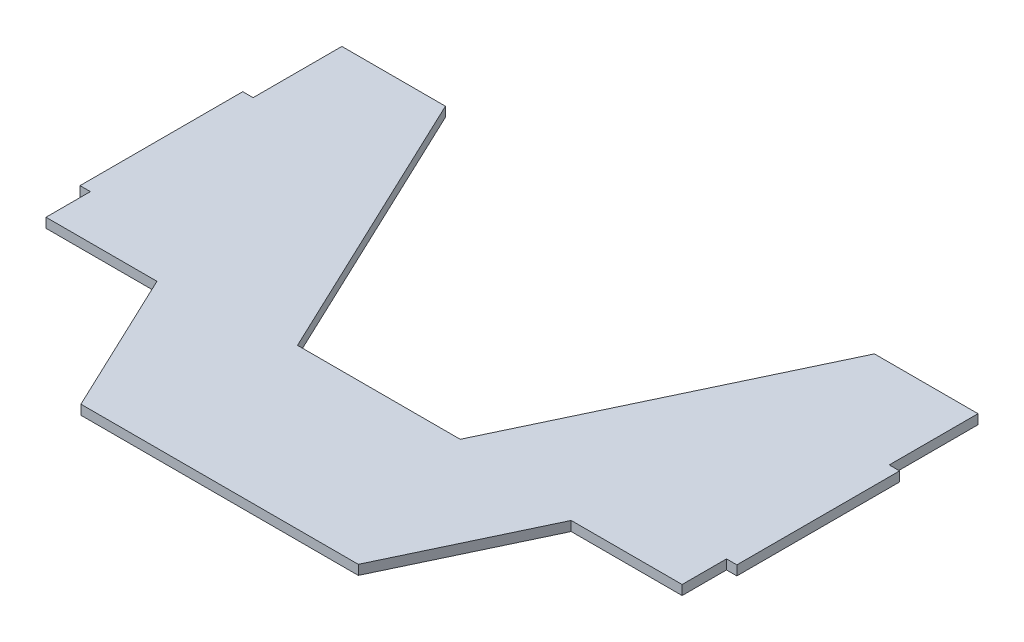
ISO-10303-21;
HEADER;
FILE_DESCRIPTION(('STEP AP214'),'2;1');
FILE_NAME('part.step','',(''),(''),'','','');
FILE_SCHEMA(('AUTOMOTIVE_DESIGN { 1 0 10303 214 1 1 1 1 }'));
ENDSEC;
DATA;
#1=APPLICATION_CONTEXT('core data for automotive mechanical design processes');
#2=APPLICATION_PROTOCOL_DEFINITION('international standard','automotive_design',2000,#1);
#3=PRODUCT_CONTEXT('',#1,'mechanical');
#4=PRODUCT('Part','Part','',(#3));
#5=PRODUCT_RELATED_PRODUCT_CATEGORY('part','',(#4));
#6=PRODUCT_DEFINITION_FORMATION('','',#4);
#7=PRODUCT_DEFINITION_CONTEXT('part definition',#1,'design');
#8=PRODUCT_DEFINITION('design','',#6,#7);
#9=PRODUCT_DEFINITION_SHAPE('','',#8);
#10=(LENGTH_UNIT() NAMED_UNIT(*) SI_UNIT(.MILLI.,.METRE.));
#11=(NAMED_UNIT(*) PLANE_ANGLE_UNIT() SI_UNIT($,.RADIAN.));
#12=(NAMED_UNIT(*) SI_UNIT($,.STERADIAN.) SOLID_ANGLE_UNIT());
#13=UNCERTAINTY_MEASURE_WITH_UNIT(LENGTH_MEASURE(1.E-05),#10,'distance_accuracy_value','');
#14=(GEOMETRIC_REPRESENTATION_CONTEXT(3) GLOBAL_UNCERTAINTY_ASSIGNED_CONTEXT((#13)) GLOBAL_UNIT_ASSIGNED_CONTEXT((#10,
#11,#12)) REPRESENTATION_CONTEXT('',''));
#15=CARTESIAN_POINT('',(0.,0.,0.));
#16=DIRECTION('',(0.,0.,1.));
#17=DIRECTION('',(1.,0.,0.));
#18=AXIS2_PLACEMENT_3D('',#15,#16,#17);
#19=CARTESIAN_POINT('',(-43.,1.3,20.));
#20=DIRECTION('',(0.,0.,-1.));
#21=DIRECTION('',(-1.,0.,0.));
#22=AXIS2_PLACEMENT_3D('',#19,#20,#21);
#23=PLANE('',#22);
#24=DIRECTION('',(0.,-1.,0.));
#25=VECTOR('',#24,1.);
#26=CARTESIAN_POINT('',(-28.,1.3,20.));
#27=LINE('',#26,#25);
#28=CARTESIAN_POINT('',(-28.,1.3,20.));
#29=VERTEX_POINT('',#28);
#30=CARTESIAN_POINT('',(-28.,0.,20.));
#31=VERTEX_POINT('',#30);
#32=EDGE_CURVE('E187',#29,#31,#27,.T.);
#33=ORIENTED_EDGE('',*,*,#32,.F.);
#34=DIRECTION('',(1.,0.,0.));
#35=VECTOR('',#34,1.);
#36=CARTESIAN_POINT('',(-43.,1.3,20.));
#37=LINE('',#36,#35);
#38=CARTESIAN_POINT('',(-43.,1.3,20.));
#39=VERTEX_POINT('',#38);
#40=EDGE_CURVE('E200',#39,#29,#37,.T.);
#41=ORIENTED_EDGE('',*,*,#40,.F.);
#42=DIRECTION('',(0.,-1.,0.));
#43=VECTOR('',#42,1.);
#44=CARTESIAN_POINT('',(-43.,1.3,20.));
#45=LINE('',#44,#43);
#46=CARTESIAN_POINT('',(-43.,0.,20.));
#47=VERTEX_POINT('',#46);
#48=EDGE_CURVE('E219',#39,#47,#45,.T.);
#49=ORIENTED_EDGE('',*,*,#48,.T.);
#50=DIRECTION('',(1.,0.,0.));
#51=VECTOR('',#50,1.);
#52=CARTESIAN_POINT('',(-43.,0.,20.));
#53=LINE('',#52,#51);
#54=EDGE_CURVE('E202',#47,#31,#53,.T.);
#55=ORIENTED_EDGE('',*,*,#54,.T.);
#56=EDGE_LOOP('',(#33,#41,#49,#55));
#57=FACE_BOUND('',#56,.T.);
#58=ADVANCED_FACE('F43',(#57),#23,.F.);
#59=CARTESIAN_POINT('',(-43.,1.3,-20.));
#60=DIRECTION('',(0.,0.,1.));
#61=DIRECTION('',(1.,0.,0.));
#62=AXIS2_PLACEMENT_3D('',#59,#60,#61);
#63=PLANE('',#62);
#64=DIRECTION('',(-1.,0.,0.));
#65=VECTOR('',#64,1.);
#66=CARTESIAN_POINT('',(-43.,1.3,-20.));
#67=LINE('',#66,#65);
#68=CARTESIAN_POINT('',(-29.,1.3,-20.));
#69=VERTEX_POINT('',#68);
#70=CARTESIAN_POINT('',(-43.,1.3,-20.));
#71=VERTEX_POINT('',#70);
#72=EDGE_CURVE('E306',#69,#71,#67,.T.);
#73=ORIENTED_EDGE('',*,*,#72,.F.);
#74=DIRECTION('',(0.,1.,0.));
#75=VECTOR('',#74,1.);
#76=CARTESIAN_POINT('',(-29.,0.,-20.));
#77=LINE('',#76,#75);
#78=CARTESIAN_POINT('',(-29.,0.,-20.));
#79=VERTEX_POINT('',#78);
#80=EDGE_CURVE('E319',#79,#69,#77,.T.);
#81=ORIENTED_EDGE('',*,*,#80,.F.);
#82=DIRECTION('',(-1.,0.,0.));
#83=VECTOR('',#82,1.);
#84=CARTESIAN_POINT('',(-43.,0.,-20.));
#85=LINE('',#84,#83);
#86=CARTESIAN_POINT('',(-43.,0.,-20.));
#87=VERTEX_POINT('',#86);
#88=EDGE_CURVE('E229',#79,#87,#85,.T.);
#89=ORIENTED_EDGE('',*,*,#88,.T.);
#90=DIRECTION('',(0.,-1.,0.));
#91=VECTOR('',#90,1.);
#92=CARTESIAN_POINT('',(-43.,1.3,-20.));
#93=LINE('',#92,#91);
#94=EDGE_CURVE('E52',#71,#87,#93,.T.);
#95=ORIENTED_EDGE('',*,*,#94,.F.);
#96=EDGE_LOOP('',(#73,#81,#89,#95));
#97=FACE_BOUND('',#96,.T.);
#98=ADVANCED_FACE('F318',(#97),#63,.F.);
#99=CARTESIAN_POINT('',(43.,1.3,-20.));
#100=DIRECTION('',(-1.,0.,0.));
#101=DIRECTION('',(0.,0.,1.));
#102=AXIS2_PLACEMENT_3D('',#99,#100,#101);
#103=PLANE('',#102);
#104=DIRECTION('',(0.,1.,0.));
#105=VECTOR('',#104,1.);
#106=CARTESIAN_POINT('',(43.,0.,-8.));
#107=LINE('',#106,#105);
#108=CARTESIAN_POINT('',(43.,0.,-8.));
#109=VERTEX_POINT('',#108);
#110=CARTESIAN_POINT('',(43.,1.3,-8.));
#111=VERTEX_POINT('',#110);
#112=EDGE_CURVE('E326',#109,#111,#107,.T.);
#113=ORIENTED_EDGE('',*,*,#112,.F.);
#114=DIRECTION('',(0.,0.,-1.));
#115=VECTOR('',#114,1.);
#116=CARTESIAN_POINT('',(43.,0.,-20.));
#117=LINE('',#116,#115);
#118=CARTESIAN_POINT('',(43.,0.,-20.));
#119=VERTEX_POINT('',#118);
#120=EDGE_CURVE('E230',#109,#119,#117,.T.);
#121=ORIENTED_EDGE('',*,*,#120,.T.);
#122=DIRECTION('',(0.,-1.,0.));
#123=VECTOR('',#122,1.);
#124=CARTESIAN_POINT('',(43.,1.3,-20.));
#125=LINE('',#124,#123);
#126=CARTESIAN_POINT('',(43.,1.3,-20.));
#127=VERTEX_POINT('',#126);
#128=EDGE_CURVE('E11',#127,#119,#125,.T.);
#129=ORIENTED_EDGE('',*,*,#128,.F.);
#130=DIRECTION('',(0.,0.,-1.));
#131=VECTOR('',#130,1.);
#132=CARTESIAN_POINT('',(43.,1.3,-20.));
#133=LINE('',#132,#131);
#134=EDGE_CURVE('E242',#111,#127,#133,.T.);
#135=ORIENTED_EDGE('',*,*,#134,.F.);
#136=EDGE_LOOP('',(#113,#121,#129,#135));
#137=FACE_BOUND('',#136,.T.);
#138=ADVANCED_FACE('F391',(#137),#103,.F.);
#139=CARTESIAN_POINT('',(-43.,1.3,-20.));
#140=DIRECTION('',(1.,0.,0.));
#141=DIRECTION('',(0.,0.,-1.));
#142=AXIS2_PLACEMENT_3D('',#139,#140,#141);
#143=PLANE('',#142);
#144=DIRECTION('',(0.,1.,0.));
#145=VECTOR('',#144,1.);
#146=CARTESIAN_POINT('',(-43.,0.,14.));
#147=LINE('',#146,#145);
#148=CARTESIAN_POINT('',(-43.,0.,14.));
#149=VERTEX_POINT('',#148);
#150=CARTESIAN_POINT('',(-43.,1.3,14.));
#151=VERTEX_POINT('',#150);
#152=EDGE_CURVE('E292',#149,#151,#147,.T.);
#153=ORIENTED_EDGE('',*,*,#152,.F.);
#154=DIRECTION('',(0.,0.,1.));
#155=VECTOR('',#154,1.);
#156=CARTESIAN_POINT('',(-43.,0.,-20.));
#157=LINE('',#156,#155);
#158=EDGE_CURVE('E235',#149,#47,#157,.T.);
#159=ORIENTED_EDGE('',*,*,#158,.T.);
#160=ORIENTED_EDGE('',*,*,#48,.F.);
#161=DIRECTION('',(0.,0.,1.));
#162=VECTOR('',#161,1.);
#163=CARTESIAN_POINT('',(-43.,1.3,-20.));
#164=LINE('',#163,#162);
#165=EDGE_CURVE('E210',#151,#39,#164,.T.);
#166=ORIENTED_EDGE('',*,*,#165,.F.);
#167=EDGE_LOOP('',(#153,#159,#160,#166));
#168=FACE_BOUND('',#167,.T.);
#169=ADVANCED_FACE('F404',(#168),#143,.F.);
#170=CARTESIAN_POINT('',(43.,0.,20.));
#171=VERTEX_POINT('',#170);
#172=CARTESIAN_POINT('',(43.,0.,14.));
#173=VERTEX_POINT('',#172);
#174=EDGE_CURVE('E225',#171,#173,#117,.T.);
#175=ORIENTED_EDGE('',*,*,#174,.T.);
#176=DIRECTION('',(0.,1.,0.));
#177=VECTOR('',#176,1.);
#178=CARTESIAN_POINT('',(43.,0.,14.));
#179=LINE('',#178,#177);
#180=CARTESIAN_POINT('',(43.,1.3,14.));
#181=VERTEX_POINT('',#180);
#182=EDGE_CURVE('E335',#173,#181,#179,.T.);
#183=ORIENTED_EDGE('',*,*,#182,.T.);
#184=CARTESIAN_POINT('',(43.,1.3,20.));
#185=VERTEX_POINT('',#184);
#186=EDGE_CURVE('E303',#185,#181,#133,.T.);
#187=ORIENTED_EDGE('',*,*,#186,.F.);
#188=DIRECTION('',(0.,-1.,0.));
#189=VECTOR('',#188,1.);
#190=CARTESIAN_POINT('',(43.,1.3,20.));
#191=LINE('',#190,#189);
#192=EDGE_CURVE('E213',#185,#171,#191,.T.);
#193=ORIENTED_EDGE('',*,*,#192,.T.);
#194=EDGE_LOOP('',(#175,#183,#187,#193));
#195=FACE_BOUND('',#194,.T.);
#196=ADVANCED_FACE('F45',(#195),#103,.F.);
#197=CARTESIAN_POINT('',(29.,0.,-20.));
#198=VERTEX_POINT('',#197);
#199=EDGE_CURVE('E231',#119,#198,#85,.T.);
#200=ORIENTED_EDGE('',*,*,#199,.T.);
#201=DIRECTION('',(0.,1.,0.));
#202=VECTOR('',#201,1.);
#203=CARTESIAN_POINT('',(29.,0.,-20.));
#204=LINE('',#203,#202);
#205=CARTESIAN_POINT('',(29.,1.3,-20.));
#206=VERTEX_POINT('',#205);
#207=EDGE_CURVE('E67',#198,#206,#204,.T.);
#208=ORIENTED_EDGE('',*,*,#207,.T.);
#209=EDGE_CURVE('E307',#127,#206,#67,.T.);
#210=ORIENTED_EDGE('',*,*,#209,.F.);
#211=ORIENTED_EDGE('',*,*,#128,.T.);
#212=EDGE_LOOP('',(#200,#208,#210,#211));
#213=FACE_BOUND('',#212,.T.);
#214=ADVANCED_FACE('F396',(#213),#63,.F.);
#215=CARTESIAN_POINT('',(-43.,0.,-8.));
#216=VERTEX_POINT('',#215);
#217=EDGE_CURVE('E236',#87,#216,#157,.T.);
#218=ORIENTED_EDGE('',*,*,#217,.T.);
#219=DIRECTION('',(0.,1.,0.));
#220=VECTOR('',#219,1.);
#221=CARTESIAN_POINT('',(-43.,0.,-8.));
#222=LINE('',#221,#220);
#223=CARTESIAN_POINT('',(-43.,1.3,-8.));
#224=VERTEX_POINT('',#223);
#225=EDGE_CURVE('E283',#216,#224,#222,.T.);
#226=ORIENTED_EDGE('',*,*,#225,.T.);
#227=EDGE_CURVE('E221',#71,#224,#164,.T.);
#228=ORIENTED_EDGE('',*,*,#227,.F.);
#229=ORIENTED_EDGE('',*,*,#94,.T.);
#230=EDGE_LOOP('',(#218,#226,#228,#229));
#231=FACE_BOUND('',#230,.T.);
#232=ADVANCED_FACE('F251',(#231),#143,.F.);
#233=CARTESIAN_POINT('',(28.,1.3,20.));
#234=VERTEX_POINT('',#233);
#235=EDGE_CURVE('E214',#234,#185,#37,.T.);
#236=ORIENTED_EDGE('',*,*,#235,.F.);
#237=DIRECTION('',(0.,-1.,0.));
#238=VECTOR('',#237,1.);
#239=CARTESIAN_POINT('',(28.,1.3,20.));
#240=LINE('',#239,#238);
#241=CARTESIAN_POINT('',(28.,0.,20.));
#242=VERTEX_POINT('',#241);
#243=EDGE_CURVE('E380',#234,#242,#240,.T.);
#244=ORIENTED_EDGE('',*,*,#243,.T.);
#245=EDGE_CURVE('E240',#242,#171,#53,.T.);
#246=ORIENTED_EDGE('',*,*,#245,.T.);
#247=ORIENTED_EDGE('',*,*,#192,.F.);
#248=EDGE_LOOP('',(#236,#244,#246,#247));
#249=FACE_BOUND('',#248,.T.);
#250=ADVANCED_FACE('F379',(#249),#23,.F.);
#251=CARTESIAN_POINT('',(0.,1.3,0.));
#252=DIRECTION('',(0.,1.,0.));
#253=DIRECTION('',(0.,0.,1.));
#254=AXIS2_PLACEMENT_3D('',#251,#252,#253);
#255=PLANE('',#254);
#256=DIRECTION('',(0.428086344739045,0.,0.903737838893539));
#257=VECTOR('',#256,1.);
#258=CARTESIAN_POINT('',(-15.947963800905,1.3,7.55429864253394));
#259=LINE('',#258,#257);
#260=CARTESIAN_POINT('',(-11.,1.3,18.));
#261=VERTEX_POINT('',#260);
#262=EDGE_CURVE('E316',#69,#261,#259,.T.);
#263=ORIENTED_EDGE('',*,*,#262,.F.);
#264=ORIENTED_EDGE('',*,*,#72,.T.);
#265=ORIENTED_EDGE('',*,*,#227,.T.);
#266=DIRECTION('',(-1.,0.,0.));
#267=VECTOR('',#266,1.);
#268=CARTESIAN_POINT('',(-43.,1.3,-8.));
#269=LINE('',#268,#267);
#270=CARTESIAN_POINT('',(-44.4,1.3,-8.));
#271=VERTEX_POINT('',#270);
#272=EDGE_CURVE('E284',#224,#271,#269,.T.);
#273=ORIENTED_EDGE('',*,*,#272,.T.);
#274=DIRECTION('',(0.,0.,1.));
#275=VECTOR('',#274,1.);
#276=CARTESIAN_POINT('',(-44.4,1.3,-8.));
#277=LINE('',#276,#275);
#278=CARTESIAN_POINT('',(-44.4,1.3,14.));
#279=VERTEX_POINT('',#278);
#280=EDGE_CURVE('E275',#271,#279,#277,.T.);
#281=ORIENTED_EDGE('',*,*,#280,.T.);
#282=DIRECTION('',(1.,0.,0.));
#283=VECTOR('',#282,1.);
#284=CARTESIAN_POINT('',(-43.,1.3,14.));
#285=LINE('',#284,#283);
#286=EDGE_CURVE('E269',#279,#151,#285,.T.);
#287=ORIENTED_EDGE('',*,*,#286,.T.);
#288=ORIENTED_EDGE('',*,*,#165,.T.);
#289=ORIENTED_EDGE('',*,*,#40,.T.);
#290=DIRECTION('',(0.428086344739045,0.,0.903737838893539));
#291=VECTOR('',#290,1.);
#292=CARTESIAN_POINT('',(-28.,1.3,20.));
#293=LINE('',#292,#291);
#294=CARTESIAN_POINT('',(-18.75,1.3,39.5277777777778));
#295=VERTEX_POINT('',#294);
#296=EDGE_CURVE('E184',#29,#295,#293,.T.);
#297=ORIENTED_EDGE('',*,*,#296,.T.);
#298=DIRECTION('',(1.,0.,0.));
#299=VECTOR('',#298,1.);
#300=CARTESIAN_POINT('',(-18.75,1.3,39.5277777777778));
#301=LINE('',#300,#299);
#302=CARTESIAN_POINT('',(18.75,1.3,39.5277777777778));
#303=VERTEX_POINT('',#302);
#304=EDGE_CURVE('E195',#295,#303,#301,.T.);
#305=ORIENTED_EDGE('',*,*,#304,.T.);
#306=DIRECTION('',(0.428086344739045,0.,-0.903737838893539));
#307=VECTOR('',#306,1.);
#308=CARTESIAN_POINT('',(18.75,1.3,39.5277777777778));
#309=LINE('',#308,#307);
#310=EDGE_CURVE('E645',#303,#234,#309,.T.);
#311=ORIENTED_EDGE('',*,*,#310,.T.);
#312=ORIENTED_EDGE('',*,*,#235,.T.);
#313=ORIENTED_EDGE('',*,*,#186,.T.);
#314=DIRECTION('',(1.,0.,0.));
#315=VECTOR('',#314,1.);
#316=CARTESIAN_POINT('',(43.,1.3,14.));
#317=LINE('',#316,#315);
#318=CARTESIAN_POINT('',(44.4,1.3,14.));
#319=VERTEX_POINT('',#318);
#320=EDGE_CURVE('E288',#181,#319,#317,.T.);
#321=ORIENTED_EDGE('',*,*,#320,.T.);
#322=DIRECTION('',(0.,0.,-1.));
#323=VECTOR('',#322,1.);
#324=CARTESIAN_POINT('',(44.4,1.3,-8.));
#325=LINE('',#324,#323);
#326=CARTESIAN_POINT('',(44.4,1.3,-8.));
#327=VERTEX_POINT('',#326);
#328=EDGE_CURVE('E352',#319,#327,#325,.T.);
#329=ORIENTED_EDGE('',*,*,#328,.T.);
#330=DIRECTION('',(-1.,0.,0.));
#331=VECTOR('',#330,1.);
#332=CARTESIAN_POINT('',(43.,1.3,-8.));
#333=LINE('',#332,#331);
#334=EDGE_CURVE('E348',#327,#111,#333,.T.);
#335=ORIENTED_EDGE('',*,*,#334,.T.);
#336=ORIENTED_EDGE('',*,*,#134,.T.);
#337=ORIENTED_EDGE('',*,*,#209,.T.);
#338=DIRECTION('',(0.428086344739045,0.,-0.903737838893539));
#339=VECTOR('',#338,1.);
#340=CARTESIAN_POINT('',(15.947963800905,1.3,7.55429864253393));
#341=LINE('',#340,#339);
#342=CARTESIAN_POINT('',(11.,1.3,18.));
#343=VERTEX_POINT('',#342);
#344=EDGE_CURVE('E667',#343,#206,#341,.T.);
#345=ORIENTED_EDGE('',*,*,#344,.F.);
#346=DIRECTION('',(1.,0.,0.));
#347=VECTOR('',#346,1.);
#348=CARTESIAN_POINT('',(0.,1.3,18.));
#349=LINE('',#348,#347);
#350=EDGE_CURVE('E204',#261,#343,#349,.T.);
#351=ORIENTED_EDGE('',*,*,#350,.F.);
#352=EDGE_LOOP('',(#263,#264,#265,#273,#281,#287,#288,#289,#297,#305,#311,#312,#313,#321,#329,
#335,#336,#337,#345,#351));
#353=FACE_BOUND('',#352,.T.);
#354=ADVANCED_FACE('F207',(#353),#255,.T.);
#355=CARTESIAN_POINT('',(0.,0.,0.));
#356=DIRECTION('',(0.,1.,0.));
#357=DIRECTION('',(0.,0.,1.));
#358=AXIS2_PLACEMENT_3D('',#355,#356,#357);
#359=PLANE('',#358);
#360=ORIENTED_EDGE('',*,*,#88,.F.);
#361=DIRECTION('',(0.428086344739045,0.,0.903737838893539));
#362=VECTOR('',#361,1.);
#363=CARTESIAN_POINT('',(-15.947963800905,0.,7.55429864253394));
#364=LINE('',#363,#362);
#365=CARTESIAN_POINT('',(-11.,0.,18.));
#366=VERTEX_POINT('',#365);
#367=EDGE_CURVE('E334',#79,#366,#364,.T.);
#368=ORIENTED_EDGE('',*,*,#367,.T.);
#369=DIRECTION('',(1.,0.,0.));
#370=VECTOR('',#369,1.);
#371=CARTESIAN_POINT('',(0.,0.,18.));
#372=LINE('',#371,#370);
#373=CARTESIAN_POINT('',(11.,0.,18.));
#374=VERTEX_POINT('',#373);
#375=EDGE_CURVE('E657',#366,#374,#372,.T.);
#376=ORIENTED_EDGE('',*,*,#375,.T.);
#377=DIRECTION('',(0.428086344739045,0.,-0.903737838893539));
#378=VECTOR('',#377,1.);
#379=CARTESIAN_POINT('',(15.947963800905,0.,7.55429864253393));
#380=LINE('',#379,#378);
#381=EDGE_CURVE('E394',#374,#198,#380,.T.);
#382=ORIENTED_EDGE('',*,*,#381,.T.);
#383=ORIENTED_EDGE('',*,*,#199,.F.);
#384=ORIENTED_EDGE('',*,*,#120,.F.);
#385=DIRECTION('',(-1.,0.,0.));
#386=VECTOR('',#385,1.);
#387=CARTESIAN_POINT('',(43.,0.,-8.));
#388=LINE('',#387,#386);
#389=CARTESIAN_POINT('',(44.4,0.,-8.));
#390=VERTEX_POINT('',#389);
#391=EDGE_CURVE('E339',#390,#109,#388,.T.);
#392=ORIENTED_EDGE('',*,*,#391,.F.);
#393=DIRECTION('',(0.,0.,-1.));
#394=VECTOR('',#393,1.);
#395=CARTESIAN_POINT('',(44.4,0.,-8.));
#396=LINE('',#395,#394);
#397=CARTESIAN_POINT('',(44.4,0.,14.));
#398=VERTEX_POINT('',#397);
#399=EDGE_CURVE('E360',#398,#390,#396,.T.);
#400=ORIENTED_EDGE('',*,*,#399,.F.);
#401=DIRECTION('',(1.,0.,0.));
#402=VECTOR('',#401,1.);
#403=CARTESIAN_POINT('',(43.,0.,14.));
#404=LINE('',#403,#402);
#405=EDGE_CURVE('E278',#173,#398,#404,.T.);
#406=ORIENTED_EDGE('',*,*,#405,.F.);
#407=ORIENTED_EDGE('',*,*,#174,.F.);
#408=ORIENTED_EDGE('',*,*,#245,.F.);
#409=DIRECTION('',(0.428086344739045,0.,-0.903737838893539));
#410=VECTOR('',#409,1.);
#411=CARTESIAN_POINT('',(18.75,0.,39.5277777777778));
#412=LINE('',#411,#410);
#413=CARTESIAN_POINT('',(18.75,0.,39.5277777777778));
#414=VERTEX_POINT('',#413);
#415=EDGE_CURVE('E59',#414,#242,#412,.T.);
#416=ORIENTED_EDGE('',*,*,#415,.F.);
#417=DIRECTION('',(1.,0.,0.));
#418=VECTOR('',#417,1.);
#419=CARTESIAN_POINT('',(-18.75,0.,39.5277777777778));
#420=LINE('',#419,#418);
#421=CARTESIAN_POINT('',(-18.75,0.,39.5277777777778));
#422=VERTEX_POINT('',#421);
#423=EDGE_CURVE('E639',#422,#414,#420,.T.);
#424=ORIENTED_EDGE('',*,*,#423,.F.);
#425=DIRECTION('',(0.428086344739045,0.,0.903737838893539));
#426=VECTOR('',#425,1.);
#427=CARTESIAN_POINT('',(-28.,0.,20.));
#428=LINE('',#427,#426);
#429=EDGE_CURVE('E638',#31,#422,#428,.T.);
#430=ORIENTED_EDGE('',*,*,#429,.F.);
#431=ORIENTED_EDGE('',*,*,#54,.F.);
#432=ORIENTED_EDGE('',*,*,#158,.F.);
#433=DIRECTION('',(1.,0.,0.));
#434=VECTOR('',#433,1.);
#435=CARTESIAN_POINT('',(-43.,0.,14.));
#436=LINE('',#435,#434);
#437=CARTESIAN_POINT('',(-44.4,0.,14.));
#438=VERTEX_POINT('',#437);
#439=EDGE_CURVE('E273',#438,#149,#436,.T.);
#440=ORIENTED_EDGE('',*,*,#439,.F.);
#441=DIRECTION('',(0.,0.,1.));
#442=VECTOR('',#441,1.);
#443=CARTESIAN_POINT('',(-44.4,0.,-8.));
#444=LINE('',#443,#442);
#445=CARTESIAN_POINT('',(-44.4,0.,-8.));
#446=VERTEX_POINT('',#445);
#447=EDGE_CURVE('E266',#446,#438,#444,.T.);
#448=ORIENTED_EDGE('',*,*,#447,.F.);
#449=DIRECTION('',(-1.,0.,0.));
#450=VECTOR('',#449,1.);
#451=CARTESIAN_POINT('',(-43.,0.,-8.));
#452=LINE('',#451,#450);
#453=EDGE_CURVE('E263',#216,#446,#452,.T.);
#454=ORIENTED_EDGE('',*,*,#453,.F.);
#455=ORIENTED_EDGE('',*,*,#217,.F.);
#456=EDGE_LOOP('',(#360,#368,#376,#382,#383,#384,#392,#400,#406,#407,#408,#416,#424,#430,#431,
#432,#440,#448,#454,#455));
#457=FACE_BOUND('',#456,.T.);
#458=ADVANCED_FACE('F259',(#457),#359,.F.);
#459=CARTESIAN_POINT('',(-43.,0.,14.));
#460=DIRECTION('',(0.,0.,1.));
#461=DIRECTION('',(1.,0.,0.));
#462=AXIS2_PLACEMENT_3D('',#459,#460,#461);
#463=PLANE('',#462);
#464=ORIENTED_EDGE('',*,*,#286,.F.);
#465=DIRECTION('',(0.,1.,0.));
#466=VECTOR('',#465,1.);
#467=CARTESIAN_POINT('',(-44.4,0.,14.));
#468=LINE('',#467,#466);
#469=EDGE_CURVE('E295',#438,#279,#468,.T.);
#470=ORIENTED_EDGE('',*,*,#469,.F.);
#471=ORIENTED_EDGE('',*,*,#439,.T.);
#472=ORIENTED_EDGE('',*,*,#152,.T.);
#473=EDGE_LOOP('',(#464,#470,#471,#472));
#474=FACE_BOUND('',#473,.T.);
#475=ADVANCED_FACE('F420',(#474),#463,.T.);
#476=CARTESIAN_POINT('',(-44.4,0.,-8.));
#477=DIRECTION('',(-1.,0.,0.));
#478=DIRECTION('',(0.,0.,1.));
#479=AXIS2_PLACEMENT_3D('',#476,#477,#478);
#480=PLANE('',#479);
#481=ORIENTED_EDGE('',*,*,#280,.F.);
#482=DIRECTION('',(0.,1.,0.));
#483=VECTOR('',#482,1.);
#484=CARTESIAN_POINT('',(-44.4,0.,-8.));
#485=LINE('',#484,#483);
#486=EDGE_CURVE('E298',#446,#271,#485,.T.);
#487=ORIENTED_EDGE('',*,*,#486,.F.);
#488=ORIENTED_EDGE('',*,*,#447,.T.);
#489=ORIENTED_EDGE('',*,*,#469,.T.);
#490=EDGE_LOOP('',(#481,#487,#488,#489));
#491=FACE_BOUND('',#490,.T.);
#492=ADVANCED_FACE('F426',(#491),#480,.T.);
#493=CARTESIAN_POINT('',(-43.,0.,-8.));
#494=DIRECTION('',(0.,0.,-1.));
#495=DIRECTION('',(-1.,0.,0.));
#496=AXIS2_PLACEMENT_3D('',#493,#494,#495);
#497=PLANE('',#496);
#498=ORIENTED_EDGE('',*,*,#272,.F.);
#499=ORIENTED_EDGE('',*,*,#225,.F.);
#500=ORIENTED_EDGE('',*,*,#453,.T.);
#501=ORIENTED_EDGE('',*,*,#486,.T.);
#502=EDGE_LOOP('',(#498,#499,#500,#501));
#503=FACE_BOUND('',#502,.T.);
#504=ADVANCED_FACE('F422',(#503),#497,.T.);
#505=CARTESIAN_POINT('',(43.,0.,-8.));
#506=DIRECTION('',(0.,0.,-1.));
#507=DIRECTION('',(-1.,0.,0.));
#508=AXIS2_PLACEMENT_3D('',#505,#506,#507);
#509=PLANE('',#508);
#510=ORIENTED_EDGE('',*,*,#334,.F.);
#511=DIRECTION('',(0.,1.,0.));
#512=VECTOR('',#511,1.);
#513=CARTESIAN_POINT('',(44.4,0.,-8.));
#514=LINE('',#513,#512);
#515=EDGE_CURVE('E343',#390,#327,#514,.T.);
#516=ORIENTED_EDGE('',*,*,#515,.F.);
#517=ORIENTED_EDGE('',*,*,#391,.T.);
#518=ORIENTED_EDGE('',*,*,#112,.T.);
#519=EDGE_LOOP('',(#510,#516,#517,#518));
#520=FACE_BOUND('',#519,.T.);
#521=ADVANCED_FACE('F425',(#520),#509,.T.);
#522=CARTESIAN_POINT('',(44.4,0.,-8.));
#523=DIRECTION('',(1.,0.,0.));
#524=DIRECTION('',(0.,0.,-1.));
#525=AXIS2_PLACEMENT_3D('',#522,#523,#524);
#526=PLANE('',#525);
#527=ORIENTED_EDGE('',*,*,#328,.F.);
#528=DIRECTION('',(0.,1.,0.));
#529=VECTOR('',#528,1.);
#530=CARTESIAN_POINT('',(44.4,0.,14.));
#531=LINE('',#530,#529);
#532=EDGE_CURVE('E340',#398,#319,#531,.T.);
#533=ORIENTED_EDGE('',*,*,#532,.F.);
#534=ORIENTED_EDGE('',*,*,#399,.T.);
#535=ORIENTED_EDGE('',*,*,#515,.T.);
#536=EDGE_LOOP('',(#527,#533,#534,#535));
#537=FACE_BOUND('',#536,.T.);
#538=ADVANCED_FACE('F435',(#537),#526,.T.);
#539=CARTESIAN_POINT('',(43.,0.,14.));
#540=DIRECTION('',(0.,0.,1.));
#541=DIRECTION('',(1.,0.,0.));
#542=AXIS2_PLACEMENT_3D('',#539,#540,#541);
#543=PLANE('',#542);
#544=ORIENTED_EDGE('',*,*,#320,.F.);
#545=ORIENTED_EDGE('',*,*,#182,.F.);
#546=ORIENTED_EDGE('',*,*,#405,.T.);
#547=ORIENTED_EDGE('',*,*,#532,.T.);
#548=EDGE_LOOP('',(#544,#545,#546,#547));
#549=FACE_BOUND('',#548,.T.);
#550=ADVANCED_FACE('F370',(#549),#543,.T.);
#551=CARTESIAN_POINT('',(0.,0.,18.));
#552=DIRECTION('',(0.,0.,1.));
#553=DIRECTION('',(1.,0.,0.));
#554=AXIS2_PLACEMENT_3D('',#551,#552,#553);
#555=PLANE('',#554);
#556=ORIENTED_EDGE('',*,*,#350,.T.);
#557=DIRECTION('',(0.,1.,0.));
#558=VECTOR('',#557,1.);
#559=CARTESIAN_POINT('',(11.,0.,18.));
#560=LINE('',#559,#558);
#561=EDGE_CURVE('E328',#374,#343,#560,.T.);
#562=ORIENTED_EDGE('',*,*,#561,.F.);
#563=ORIENTED_EDGE('',*,*,#375,.F.);
#564=DIRECTION('',(0.,1.,0.));
#565=VECTOR('',#564,1.);
#566=CARTESIAN_POINT('',(-11.,0.,18.));
#567=LINE('',#566,#565);
#568=EDGE_CURVE('E322',#366,#261,#567,.T.);
#569=ORIENTED_EDGE('',*,*,#568,.T.);
#570=EDGE_LOOP('',(#556,#562,#563,#569));
#571=FACE_BOUND('',#570,.T.);
#572=ADVANCED_FACE('F441',(#571),#555,.F.);
#573=CARTESIAN_POINT('',(-15.947963800905,0.,7.55429864253394));
#574=DIRECTION('',(-0.903737838893539,0.,0.428086344739045));
#575=DIRECTION('',(0.428086344739045,0.,0.903737838893539));
#576=AXIS2_PLACEMENT_3D('',#573,#574,#575);
#577=PLANE('',#576);
#578=ORIENTED_EDGE('',*,*,#262,.T.);
#579=ORIENTED_EDGE('',*,*,#568,.F.);
#580=ORIENTED_EDGE('',*,*,#367,.F.);
#581=ORIENTED_EDGE('',*,*,#80,.T.);
#582=EDGE_LOOP('',(#578,#579,#580,#581));
#583=FACE_BOUND('',#582,.T.);
#584=ADVANCED_FACE('F444',(#583),#577,.F.);
#585=CARTESIAN_POINT('',(15.947963800905,0.,7.55429864253393));
#586=DIRECTION('',(0.903737838893539,0.,0.428086344739045));
#587=DIRECTION('',(0.428086344739045,0.,-0.903737838893539));
#588=AXIS2_PLACEMENT_3D('',#585,#586,#587);
#589=PLANE('',#588);
#590=ORIENTED_EDGE('',*,*,#344,.T.);
#591=ORIENTED_EDGE('',*,*,#207,.F.);
#592=ORIENTED_EDGE('',*,*,#381,.F.);
#593=ORIENTED_EDGE('',*,*,#561,.T.);
#594=EDGE_LOOP('',(#590,#591,#592,#593));
#595=FACE_BOUND('',#594,.T.);
#596=ADVANCED_FACE('F446',(#595),#589,.F.);
#597=CARTESIAN_POINT('',(-28.,1.3,20.));
#598=DIRECTION('',(0.903737838893539,0.,-0.428086344739045));
#599=DIRECTION('',(-0.428086344739045,0.,-0.903737838893539));
#600=AXIS2_PLACEMENT_3D('',#597,#598,#599);
#601=PLANE('',#600);
#602=ORIENTED_EDGE('',*,*,#429,.T.);
#603=DIRECTION('',(0.,-1.,0.));
#604=VECTOR('',#603,1.);
#605=CARTESIAN_POINT('',(-18.75,1.3,39.5277777777778));
#606=LINE('',#605,#604);
#607=EDGE_CURVE('E190',#295,#422,#606,.T.);
#608=ORIENTED_EDGE('',*,*,#607,.F.);
#609=ORIENTED_EDGE('',*,*,#296,.F.);
#610=ORIENTED_EDGE('',*,*,#32,.T.);
#611=EDGE_LOOP('',(#602,#608,#609,#610));
#612=FACE_BOUND('',#611,.T.);
#613=ADVANCED_FACE('F186',(#612),#601,.F.);
#614=CARTESIAN_POINT('',(-18.75,1.3,39.5277777777778));
#615=DIRECTION('',(0.,0.,-1.));
#616=DIRECTION('',(-1.,0.,0.));
#617=AXIS2_PLACEMENT_3D('',#614,#615,#616);
#618=PLANE('',#617);
#619=ORIENTED_EDGE('',*,*,#423,.T.);
#620=DIRECTION('',(0.,-1.,0.));
#621=VECTOR('',#620,1.);
#622=CARTESIAN_POINT('',(18.75,1.3,39.5277777777778));
#623=LINE('',#622,#621);
#624=EDGE_CURVE('E652',#303,#414,#623,.T.);
#625=ORIENTED_EDGE('',*,*,#624,.F.);
#626=ORIENTED_EDGE('',*,*,#304,.F.);
#627=ORIENTED_EDGE('',*,*,#607,.T.);
#628=EDGE_LOOP('',(#619,#625,#626,#627));
#629=FACE_BOUND('',#628,.T.);
#630=ADVANCED_FACE('F453',(#629),#618,.F.);
#631=CARTESIAN_POINT('',(18.75,1.3,39.5277777777778));
#632=DIRECTION('',(-0.903737838893539,0.,-0.428086344739045));
#633=DIRECTION('',(-0.428086344739045,0.,0.903737838893539));
#634=AXIS2_PLACEMENT_3D('',#631,#632,#633);
#635=PLANE('',#634);
#636=ORIENTED_EDGE('',*,*,#415,.T.);
#637=ORIENTED_EDGE('',*,*,#243,.F.);
#638=ORIENTED_EDGE('',*,*,#310,.F.);
#639=ORIENTED_EDGE('',*,*,#624,.T.);
#640=EDGE_LOOP('',(#636,#637,#638,#639));
#641=FACE_BOUND('',#640,.T.);
#642=ADVANCED_FACE('F456',(#641),#635,.F.);
#643=CLOSED_SHELL('',(#58,#98,#138,#169,#196,#214,#232,#250,#354,#458,#475,#492,#504,#521,#538,
#550,#572,#584,#596,#613,#630,#642));
#644=MANIFOLD_SOLID_BREP('B2',#643);
#645=ADVANCED_BREP_SHAPE_REPRESENTATION('',(#18,#644),#14);
#646=SHAPE_DEFINITION_REPRESENTATION(#9,#645);
ENDSEC;
END-ISO-10303-21;
